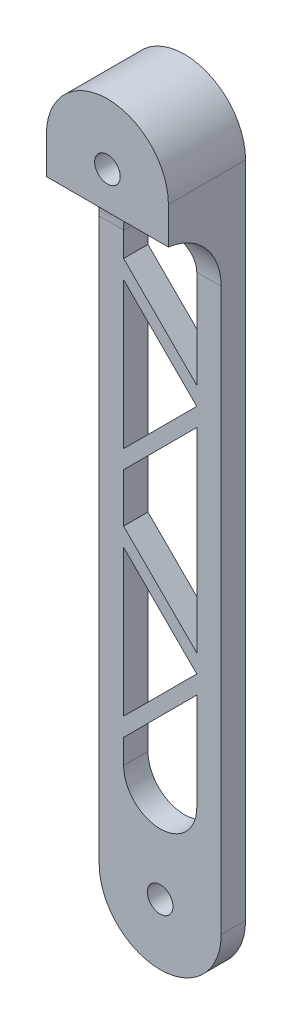
ISO-10303-21;
HEADER;
FILE_DESCRIPTION(('STEP AP214'),'2;1');
FILE_NAME('part.step','',(''),(''),'','','');
FILE_SCHEMA(('AUTOMOTIVE_DESIGN { 1 0 10303 214 1 1 1 1 }'));
ENDSEC;
DATA;
#1=APPLICATION_CONTEXT('core data for automotive mechanical design processes');
#2=APPLICATION_PROTOCOL_DEFINITION('international standard','automotive_design',2000,#1);
#3=PRODUCT_CONTEXT('',#1,'mechanical');
#4=PRODUCT('Part','Part','',(#3));
#5=PRODUCT_RELATED_PRODUCT_CATEGORY('part','',(#4));
#6=PRODUCT_DEFINITION_FORMATION('','',#4);
#7=PRODUCT_DEFINITION_CONTEXT('part definition',#1,'design');
#8=PRODUCT_DEFINITION('design','',#6,#7);
#9=PRODUCT_DEFINITION_SHAPE('','',#8);
#10=(LENGTH_UNIT() NAMED_UNIT(*) SI_UNIT(.MILLI.,.METRE.));
#11=(NAMED_UNIT(*) PLANE_ANGLE_UNIT() SI_UNIT($,.RADIAN.));
#12=(NAMED_UNIT(*) SI_UNIT($,.STERADIAN.) SOLID_ANGLE_UNIT());
#13=UNCERTAINTY_MEASURE_WITH_UNIT(LENGTH_MEASURE(1.E-05),#10,'distance_accuracy_value','');
#14=(GEOMETRIC_REPRESENTATION_CONTEXT(3) GLOBAL_UNCERTAINTY_ASSIGNED_CONTEXT((#13)) GLOBAL_UNIT_ASSIGNED_CONTEXT((#10,
#11,#12)) REPRESENTATION_CONTEXT('',''));
#15=CARTESIAN_POINT('',(0.,0.,0.));
#16=DIRECTION('',(0.,0.,1.));
#17=DIRECTION('',(1.,0.,0.));
#18=AXIS2_PLACEMENT_3D('',#15,#16,#17);
#19=CARTESIAN_POINT('',(0.,0.,4.));
#20=DIRECTION('',(0.,0.,1.));
#21=DIRECTION('',(1.,0.,0.));
#22=AXIS2_PLACEMENT_3D('',#19,#20,#21);
#23=PLANE('',#22);
#24=CARTESIAN_POINT('',(0.,-54.,4.));
#25=DIRECTION('',(0.,0.,1.));
#26=DIRECTION('',(1.,0.,0.));
#27=AXIS2_PLACEMENT_3D('',#24,#25,#26);
#28=CIRCLE('',#27,2.1);
#29=CARTESIAN_POINT('',(2.09999999999999,-54.,4.));
#30=VERTEX_POINT('',#29);
#31=EDGE_CURVE('E355',#30,#30,#28,.T.);
#32=ORIENTED_EDGE('',*,*,#31,.F.);
#33=EDGE_LOOP('',(#32));
#34=FACE_BOUND('',#33,.T.);
#35=DIRECTION('',(0.707106781186551,0.707106781186544,0.));
#36=VECTOR('',#35,1.);
#37=CARTESIAN_POINT('',(14.,-14.0000000000001,4.));
#38=LINE('',#37,#36);
#39=CARTESIAN_POINT('',(-6.00000000000002,-33.9999999999999,4.));
#40=VERTEX_POINT('',#39);
#41=CARTESIAN_POINT('',(5.99999999999999,-22.,4.));
#42=VERTEX_POINT('',#41);
#43=EDGE_CURVE('E391',#40,#42,#38,.T.);
#44=ORIENTED_EDGE('',*,*,#43,.T.);
#45=DIRECTION('',(0.,-1.,0.));
#46=VECTOR('',#45,1.);
#47=CARTESIAN_POINT('',(5.99999999999999,0.,4.));
#48=LINE('',#47,#46);
#49=CARTESIAN_POINT('',(5.99999999999999,-38.,4.));
#50=VERTEX_POINT('',#49);
#51=EDGE_CURVE('E379',#42,#50,#48,.T.);
#52=ORIENTED_EDGE('',*,*,#51,.T.);
#53=CARTESIAN_POINT('',(0.,-38.,4.));
#54=DIRECTION('',(0.,0.,1.));
#55=DIRECTION('',(1.,0.,0.));
#56=AXIS2_PLACEMENT_3D('',#53,#54,#55);
#57=CIRCLE('',#56,6.00000000000001);
#58=CARTESIAN_POINT('',(-6.00000000000002,-38.,4.));
#59=VERTEX_POINT('',#58);
#60=EDGE_CURVE('E392',#59,#50,#57,.T.);
#61=ORIENTED_EDGE('',*,*,#60,.F.);
#62=DIRECTION('',(0.,-1.,0.));
#63=VECTOR('',#62,1.);
#64=CARTESIAN_POINT('',(-6.00000000000002,0.,4.));
#65=LINE('',#64,#63);
#66=EDGE_CURVE('E389',#40,#59,#65,.T.);
#67=ORIENTED_EDGE('',*,*,#66,.F.);
#68=EDGE_LOOP('',(#44,#52,#61,#67));
#69=FACE_BOUND('',#68,.T.);
#70=DIRECTION('',(-0.707106781186551,0.707106781186544,0.));
#71=VECTOR('',#70,1.);
#72=CARTESIAN_POINT('',(-6.50000000000004,-6.5000000000001,4.));
#73=LINE('',#72,#71);
#74=CARTESIAN_POINT('',(5.99999999999999,-19.,4.));
#75=VERTEX_POINT('',#74);
#76=CARTESIAN_POINT('',(-6.00000000000002,-7.00000000000012,4.));
#77=VERTEX_POINT('',#76);
#78=EDGE_CURVE('E381',#75,#77,#73,.T.);
#79=ORIENTED_EDGE('',*,*,#78,.F.);
#80=DIRECTION('',(-0.707106781186551,-0.707106781186544,0.));
#81=VECTOR('',#80,1.);
#82=CARTESIAN_POINT('',(12.5,-12.5000000000001,4.));
#83=LINE('',#82,#81);
#84=CARTESIAN_POINT('',(-6.00000000000002,-30.9999999999999,4.));
#85=VERTEX_POINT('',#84);
#86=EDGE_CURVE('E390',#75,#85,#83,.T.);
#87=ORIENTED_EDGE('',*,*,#86,.T.);
#88=EDGE_CURVE('E384',#77,#85,#65,.T.);
#89=ORIENTED_EDGE('',*,*,#88,.F.);
#90=EDGE_LOOP('',(#79,#87,#89));
#91=FACE_BOUND('',#90,.T.);
#92=CARTESIAN_POINT('',(5.99999999999999,16.,4.));
#93=VERTEX_POINT('',#92);
#94=CARTESIAN_POINT('',(5.99999999999999,-16.,4.));
#95=VERTEX_POINT('',#94);
#96=EDGE_CURVE('E374',#93,#95,#48,.T.);
#97=ORIENTED_EDGE('',*,*,#96,.T.);
#98=DIRECTION('',(0.707106781186551,-0.707106781186544,0.));
#99=VECTOR('',#98,1.);
#100=CARTESIAN_POINT('',(-5.00000000000003,-5.00000000000008,4.));
#101=LINE('',#100,#99);
#102=CARTESIAN_POINT('',(-6.00000000000002,-4.00000000000011,4.));
#103=VERTEX_POINT('',#102);
#104=EDGE_CURVE('E377',#103,#95,#101,.T.);
#105=ORIENTED_EDGE('',*,*,#104,.F.);
#106=CARTESIAN_POINT('',(-6.00000000000002,4.00000000000011,4.));
#107=VERTEX_POINT('',#106);
#108=EDGE_CURVE('E366',#107,#103,#65,.T.);
#109=ORIENTED_EDGE('',*,*,#108,.F.);
#110=DIRECTION('',(0.707106781186551,0.707106781186544,0.));
#111=VECTOR('',#110,1.);
#112=CARTESIAN_POINT('',(-5.00000000000003,5.00000000000008,4.));
#113=LINE('',#112,#111);
#114=EDGE_CURVE('E375',#107,#93,#113,.T.);
#115=ORIENTED_EDGE('',*,*,#114,.T.);
#116=EDGE_LOOP('',(#97,#105,#109,#115));
#117=FACE_BOUND('',#116,.T.);
#118=DIRECTION('',(-0.707106781186551,0.707106781186544,0.));
#119=VECTOR('',#118,1.);
#120=CARTESIAN_POINT('',(12.5,12.5000000000001,4.));
#121=LINE('',#120,#119);
#122=CARTESIAN_POINT('',(5.99999999999999,19.,4.));
#123=VERTEX_POINT('',#122);
#124=CARTESIAN_POINT('',(-6.00000000000002,30.9999999999999,4.));
#125=VERTEX_POINT('',#124);
#126=EDGE_CURVE('E361',#123,#125,#121,.T.);
#127=ORIENTED_EDGE('',*,*,#126,.F.);
#128=DIRECTION('',(-0.707106781186551,-0.707106781186544,0.));
#129=VECTOR('',#128,1.);
#130=CARTESIAN_POINT('',(-6.50000000000004,6.5000000000001,4.));
#131=LINE('',#130,#129);
#132=CARTESIAN_POINT('',(-6.00000000000002,7.00000000000012,4.));
#133=VERTEX_POINT('',#132);
#134=EDGE_CURVE('E367',#123,#133,#131,.T.);
#135=ORIENTED_EDGE('',*,*,#134,.T.);
#136=EDGE_CURVE('E359',#125,#133,#65,.T.);
#137=ORIENTED_EDGE('',*,*,#136,.F.);
#138=EDGE_LOOP('',(#127,#135,#137));
#139=FACE_BOUND('',#138,.T.);
#140=DIRECTION('',(0.,-1.,0.));
#141=VECTOR('',#140,1.);
#142=CARTESIAN_POINT('',(10.,0.,4.));
#143=LINE('',#142,#141);
#144=CARTESIAN_POINT('',(10.,38.0415440153372,4.));
#145=VERTEX_POINT('',#144);
#146=CARTESIAN_POINT('',(9.99999999999999,-54.,4.));
#147=VERTEX_POINT('',#146);
#148=EDGE_CURVE('E400',#145,#147,#143,.T.);
#149=ORIENTED_EDGE('',*,*,#148,.F.);
#150=DIRECTION('',(-1.,0.,0.));
#151=VECTOR('',#150,1.);
#152=CARTESIAN_POINT('',(-9.99999999999999,38.0415440153372,4.));
#153=LINE('',#152,#151);
#154=CARTESIAN_POINT('',(5.99985617284196,38.0415440153372,4.));
#155=VERTEX_POINT('',#154);
#156=EDGE_CURVE('E507',#145,#155,#153,.T.);
#157=ORIENTED_EDGE('',*,*,#156,.T.);
#158=CARTESIAN_POINT('',(0.,38.,4.));
#159=DIRECTION('',(0.,0.,1.));
#160=DIRECTION('',(1.,0.,0.));
#161=AXIS2_PLACEMENT_3D('',#158,#159,#160);
#162=CIRCLE('',#161,6.00000000000001);
#163=CARTESIAN_POINT('',(5.99999999999999,38.,4.));
#164=VERTEX_POINT('',#163);
#165=EDGE_CURVE('E404',#164,#155,#162,.T.);
#166=ORIENTED_EDGE('',*,*,#165,.F.);
#167=CARTESIAN_POINT('',(5.99999999999999,22.,4.));
#168=VERTEX_POINT('',#167);
#169=EDGE_CURVE('E378',#164,#168,#48,.T.);
#170=ORIENTED_EDGE('',*,*,#169,.T.);
#171=DIRECTION('',(0.707106781186551,-0.707106781186544,0.));
#172=VECTOR('',#171,1.);
#173=CARTESIAN_POINT('',(14.,14.0000000000001,4.));
#174=LINE('',#173,#172);
#175=CARTESIAN_POINT('',(-6.00000000000002,33.9999999999999,4.));
#176=VERTEX_POINT('',#175);
#177=EDGE_CURVE('E402',#176,#168,#174,.T.);
#178=ORIENTED_EDGE('',*,*,#177,.F.);
#179=CARTESIAN_POINT('',(-6.00000000000002,38.,4.));
#180=VERTEX_POINT('',#179);
#181=EDGE_CURVE('E362',#180,#176,#65,.T.);
#182=ORIENTED_EDGE('',*,*,#181,.F.);
#183=CARTESIAN_POINT('',(-5.99985617284196,38.0415440153372,4.));
#184=VERTEX_POINT('',#183);
#185=EDGE_CURVE('E410',#184,#180,#162,.T.);
#186=ORIENTED_EDGE('',*,*,#185,.F.);
#187=DIRECTION('',(-1.,0.,0.));
#188=VECTOR('',#187,1.);
#189=CARTESIAN_POINT('',(-9.99999999999999,38.0415440153372,4.));
#190=LINE('',#189,#188);
#191=CARTESIAN_POINT('',(-9.99999999999999,38.0415440153372,4.));
#192=VERTEX_POINT('',#191);
#193=EDGE_CURVE('E172',#184,#192,#190,.T.);
#194=ORIENTED_EDGE('',*,*,#193,.T.);
#195=DIRECTION('',(0.,-1.,0.));
#196=VECTOR('',#195,1.);
#197=CARTESIAN_POINT('',(-9.99999999999999,0.,4.));
#198=LINE('',#197,#196);
#199=CARTESIAN_POINT('',(-9.99999999999999,-54.,4.));
#200=VERTEX_POINT('',#199);
#201=EDGE_CURVE('E397',#192,#200,#198,.T.);
#202=ORIENTED_EDGE('',*,*,#201,.T.);
#203=CARTESIAN_POINT('',(0.,-54.,4.));
#204=DIRECTION('',(0.,0.,1.));
#205=DIRECTION('',(1.,0.,0.));
#206=AXIS2_PLACEMENT_3D('',#203,#204,#205);
#207=CIRCLE('',#206,10.);
#208=EDGE_CURVE('E500',#200,#147,#207,.T.);
#209=ORIENTED_EDGE('',*,*,#208,.T.);
#210=EDGE_LOOP('',(#149,#157,#166,#170,#178,#182,#186,#194,#202,#209));
#211=FACE_BOUND('',#210,.T.);
#212=ADVANCED_FACE('F158',(#34,#69,#91,#117,#139,#211),#23,.T.);
#213=CARTESIAN_POINT('',(0.,54.,4.));
#214=DIRECTION('',(0.,0.,-1.));
#215=DIRECTION('',(-1.,0.,0.));
#216=AXIS2_PLACEMENT_3D('',#213,#214,#215);
#217=CYLINDRICAL_SURFACE('',#216,2.1);
#218=CARTESIAN_POINT('',(0.,54.,0.));
#219=DIRECTION('',(0.,0.,1.));
#220=DIRECTION('',(1.,0.,0.));
#221=AXIS2_PLACEMENT_3D('',#218,#219,#220);
#222=CIRCLE('',#221,2.1);
#223=CARTESIAN_POINT('',(2.09999999999999,54.,0.));
#224=VERTEX_POINT('',#223);
#225=EDGE_CURVE('E443',#224,#224,#222,.T.);
#226=ORIENTED_EDGE('',*,*,#225,.F.);
#227=EDGE_LOOP('',(#226));
#228=FACE_BOUND('',#227,.T.);
#229=CARTESIAN_POINT('',(0.,54.,12.6500000000001));
#230=DIRECTION('',(0.,0.,1.));
#231=DIRECTION('',(1.,0.,0.));
#232=AXIS2_PLACEMENT_3D('',#229,#230,#231);
#233=CIRCLE('',#232,2.1);
#234=CARTESIAN_POINT('',(2.09999999999999,54.,12.6500000000001));
#235=VERTEX_POINT('',#234);
#236=EDGE_CURVE('E358',#235,#235,#233,.T.);
#237=ORIENTED_EDGE('',*,*,#236,.T.);
#238=EDGE_LOOP('',(#237));
#239=FACE_BOUND('',#238,.T.);
#240=ADVANCED_FACE('F544',(#228,#239),#217,.F.);
#241=CARTESIAN_POINT('',(5.99999999999999,0.,4.));
#242=DIRECTION('',(1.,0.,0.));
#243=DIRECTION('',(0.,0.,-1.));
#244=AXIS2_PLACEMENT_3D('',#241,#242,#243);
#245=PLANE('',#244);
#246=DIRECTION('',(0.,-1.,0.));
#247=VECTOR('',#246,1.);
#248=CARTESIAN_POINT('',(5.99999999999999,0.,0.));
#249=LINE('',#248,#247);
#250=CARTESIAN_POINT('',(5.99999999999999,38.,0.));
#251=VERTEX_POINT('',#250);
#252=CARTESIAN_POINT('',(5.99999999999999,22.,0.));
#253=VERTEX_POINT('',#252);
#254=EDGE_CURVE('E364',#251,#253,#249,.T.);
#255=ORIENTED_EDGE('',*,*,#254,.T.);
#256=DIRECTION('',(0.,0.,-1.));
#257=VECTOR('',#256,1.);
#258=CARTESIAN_POINT('',(5.99999999999999,22.,4.));
#259=LINE('',#258,#257);
#260=EDGE_CURVE('E458',#168,#253,#259,.T.);
#261=ORIENTED_EDGE('',*,*,#260,.F.);
#262=ORIENTED_EDGE('',*,*,#169,.F.);
#263=DIRECTION('',(0.,0.,-1.));
#264=VECTOR('',#263,1.);
#265=CARTESIAN_POINT('',(5.99999999999999,38.,4.));
#266=LINE('',#265,#264);
#267=EDGE_CURVE('E459',#164,#251,#266,.T.);
#268=ORIENTED_EDGE('',*,*,#267,.T.);
#269=EDGE_LOOP('',(#255,#261,#262,#268));
#270=FACE_BOUND('',#269,.T.);
#271=ADVANCED_FACE('F524',(#270),#245,.F.);
#272=CARTESIAN_POINT('',(5.99999999999999,16.,0.));
#273=VERTEX_POINT('',#272);
#274=CARTESIAN_POINT('',(5.99999999999999,-16.,0.));
#275=VERTEX_POINT('',#274);
#276=EDGE_CURVE('E421',#273,#275,#249,.T.);
#277=ORIENTED_EDGE('',*,*,#276,.T.);
#278=DIRECTION('',(0.,0.,-1.));
#279=VECTOR('',#278,1.);
#280=CARTESIAN_POINT('',(5.99999999999999,-16.,4.));
#281=LINE('',#280,#279);
#282=EDGE_CURVE('E483',#95,#275,#281,.T.);
#283=ORIENTED_EDGE('',*,*,#282,.F.);
#284=ORIENTED_EDGE('',*,*,#96,.F.);
#285=DIRECTION('',(0.,0.,-1.));
#286=VECTOR('',#285,1.);
#287=CARTESIAN_POINT('',(5.99999999999999,16.,4.));
#288=LINE('',#287,#286);
#289=EDGE_CURVE('E488',#93,#273,#288,.T.);
#290=ORIENTED_EDGE('',*,*,#289,.T.);
#291=EDGE_LOOP('',(#277,#283,#284,#290));
#292=FACE_BOUND('',#291,.T.);
#293=ADVANCED_FACE('F569',(#292),#245,.F.);
#294=CARTESIAN_POINT('',(5.99999999999999,-22.,0.));
#295=VERTEX_POINT('',#294);
#296=CARTESIAN_POINT('',(5.99999999999999,-38.,0.));
#297=VERTEX_POINT('',#296);
#298=EDGE_CURVE('E430',#295,#297,#249,.T.);
#299=ORIENTED_EDGE('',*,*,#298,.T.);
#300=DIRECTION('',(0.,0.,-1.));
#301=VECTOR('',#300,1.);
#302=CARTESIAN_POINT('',(5.99999999999999,-38.,4.));
#303=LINE('',#302,#301);
#304=EDGE_CURVE('E469',#50,#297,#303,.T.);
#305=ORIENTED_EDGE('',*,*,#304,.F.);
#306=ORIENTED_EDGE('',*,*,#51,.F.);
#307=DIRECTION('',(0.,0.,-1.));
#308=VECTOR('',#307,1.);
#309=CARTESIAN_POINT('',(5.99999999999999,-22.,4.));
#310=LINE('',#309,#308);
#311=EDGE_CURVE('E475',#42,#295,#310,.T.);
#312=ORIENTED_EDGE('',*,*,#311,.T.);
#313=EDGE_LOOP('',(#299,#305,#306,#312));
#314=FACE_BOUND('',#313,.T.);
#315=ADVANCED_FACE('F553',(#314),#245,.F.);
#316=CARTESIAN_POINT('',(0.,-38.,4.));
#317=DIRECTION('',(0.,0.,-1.));
#318=DIRECTION('',(-1.,0.,0.));
#319=AXIS2_PLACEMENT_3D('',#316,#317,#318);
#320=CYLINDRICAL_SURFACE('',#319,6.00000000000001);
#321=CARTESIAN_POINT('',(0.,-38.,0.));
#322=DIRECTION('',(0.,0.,1.));
#323=DIRECTION('',(1.,0.,0.));
#324=AXIS2_PLACEMENT_3D('',#321,#322,#323);
#325=CIRCLE('',#324,6.00000000000001);
#326=CARTESIAN_POINT('',(-6.00000000000002,-38.,0.));
#327=VERTEX_POINT('',#326);
#328=EDGE_CURVE('E441',#327,#297,#325,.T.);
#329=ORIENTED_EDGE('',*,*,#328,.F.);
#330=DIRECTION('',(0.,0.,-1.));
#331=VECTOR('',#330,1.);
#332=CARTESIAN_POINT('',(-6.00000000000002,-38.,4.));
#333=LINE('',#332,#331);
#334=EDGE_CURVE('E470',#59,#327,#333,.T.);
#335=ORIENTED_EDGE('',*,*,#334,.F.);
#336=ORIENTED_EDGE('',*,*,#60,.T.);
#337=ORIENTED_EDGE('',*,*,#304,.T.);
#338=EDGE_LOOP('',(#329,#335,#336,#337));
#339=FACE_BOUND('',#338,.T.);
#340=ADVANCED_FACE('F532',(#339),#320,.F.);
#341=CARTESIAN_POINT('',(-6.00000000000002,0.,4.));
#342=DIRECTION('',(1.,0.,0.));
#343=DIRECTION('',(0.,0.,-1.));
#344=AXIS2_PLACEMENT_3D('',#341,#342,#343);
#345=PLANE('',#344);
#346=DIRECTION('',(0.,-1.,0.));
#347=VECTOR('',#346,1.);
#348=CARTESIAN_POINT('',(-6.00000000000002,0.,0.));
#349=LINE('',#348,#347);
#350=CARTESIAN_POINT('',(-6.00000000000002,38.,0.));
#351=VERTEX_POINT('',#350);
#352=CARTESIAN_POINT('',(-6.00000000000002,33.9999999999999,0.));
#353=VERTEX_POINT('',#352);
#354=EDGE_CURVE('E413',#351,#353,#349,.T.);
#355=ORIENTED_EDGE('',*,*,#354,.F.);
#356=DIRECTION('',(0.,0.,-1.));
#357=VECTOR('',#356,1.);
#358=CARTESIAN_POINT('',(-6.00000000000002,38.,4.));
#359=LINE('',#358,#357);
#360=EDGE_CURVE('E465',#180,#351,#359,.T.);
#361=ORIENTED_EDGE('',*,*,#360,.F.);
#362=ORIENTED_EDGE('',*,*,#181,.T.);
#363=DIRECTION('',(0.,0.,-1.));
#364=VECTOR('',#363,1.);
#365=CARTESIAN_POINT('',(-6.00000000000002,33.9999999999999,4.));
#366=LINE('',#365,#364);
#367=EDGE_CURVE('E462',#176,#353,#366,.T.);
#368=ORIENTED_EDGE('',*,*,#367,.T.);
#369=EDGE_LOOP('',(#355,#361,#362,#368));
#370=FACE_BOUND('',#369,.T.);
#371=ADVANCED_FACE('F530',(#370),#345,.T.);
#372=CARTESIAN_POINT('',(-6.00000000000002,30.9999999999999,0.));
#373=VERTEX_POINT('',#372);
#374=CARTESIAN_POINT('',(-6.00000000000002,7.00000000000012,0.));
#375=VERTEX_POINT('',#374);
#376=EDGE_CURVE('E407',#373,#375,#349,.T.);
#377=ORIENTED_EDGE('',*,*,#376,.F.);
#378=DIRECTION('',(0.,0.,-1.));
#379=VECTOR('',#378,1.);
#380=CARTESIAN_POINT('',(-6.00000000000002,30.9999999999999,4.));
#381=LINE('',#380,#379);
#382=EDGE_CURVE('E482',#125,#373,#381,.T.);
#383=ORIENTED_EDGE('',*,*,#382,.F.);
#384=ORIENTED_EDGE('',*,*,#136,.T.);
#385=DIRECTION('',(0.,0.,-1.));
#386=VECTOR('',#385,1.);
#387=CARTESIAN_POINT('',(-6.00000000000002,7.00000000000012,4.));
#388=LINE('',#387,#386);
#389=EDGE_CURVE('E490',#133,#375,#388,.T.);
#390=ORIENTED_EDGE('',*,*,#389,.T.);
#391=EDGE_LOOP('',(#377,#383,#384,#390));
#392=FACE_BOUND('',#391,.T.);
#393=ADVANCED_FACE('F529',(#392),#345,.T.);
#394=CARTESIAN_POINT('',(-6.00000000000002,4.00000000000011,0.));
#395=VERTEX_POINT('',#394);
#396=CARTESIAN_POINT('',(-6.00000000000002,-4.00000000000011,0.));
#397=VERTEX_POINT('',#396);
#398=EDGE_CURVE('E412',#395,#397,#349,.T.);
#399=ORIENTED_EDGE('',*,*,#398,.F.);
#400=DIRECTION('',(0.,0.,-1.));
#401=VECTOR('',#400,1.);
#402=CARTESIAN_POINT('',(-6.00000000000002,4.00000000000011,4.));
#403=LINE('',#402,#401);
#404=EDGE_CURVE('E478',#107,#395,#403,.T.);
#405=ORIENTED_EDGE('',*,*,#404,.F.);
#406=ORIENTED_EDGE('',*,*,#108,.T.);
#407=DIRECTION('',(0.,0.,-1.));
#408=VECTOR('',#407,1.);
#409=CARTESIAN_POINT('',(-6.00000000000002,-4.00000000000011,4.));
#410=LINE('',#409,#408);
#411=EDGE_CURVE('E481',#103,#397,#410,.T.);
#412=ORIENTED_EDGE('',*,*,#411,.T.);
#413=EDGE_LOOP('',(#399,#405,#406,#412));
#414=FACE_BOUND('',#413,.T.);
#415=ADVANCED_FACE('F652',(#414),#345,.T.);
#416=CARTESIAN_POINT('',(-6.00000000000002,-7.00000000000012,0.));
#417=VERTEX_POINT('',#416);
#418=CARTESIAN_POINT('',(-6.00000000000002,-30.9999999999999,0.));
#419=VERTEX_POINT('',#418);
#420=EDGE_CURVE('E427',#417,#419,#349,.T.);
#421=ORIENTED_EDGE('',*,*,#420,.F.);
#422=DIRECTION('',(0.,0.,-1.));
#423=VECTOR('',#422,1.);
#424=CARTESIAN_POINT('',(-6.00000000000002,-7.00000000000012,4.));
#425=LINE('',#424,#423);
#426=EDGE_CURVE('E468',#77,#417,#425,.T.);
#427=ORIENTED_EDGE('',*,*,#426,.F.);
#428=ORIENTED_EDGE('',*,*,#88,.T.);
#429=DIRECTION('',(0.,0.,-1.));
#430=VECTOR('',#429,1.);
#431=CARTESIAN_POINT('',(-6.00000000000002,-30.9999999999999,4.));
#432=LINE('',#431,#430);
#433=EDGE_CURVE('E474',#85,#419,#432,.T.);
#434=ORIENTED_EDGE('',*,*,#433,.T.);
#435=EDGE_LOOP('',(#421,#427,#428,#434));
#436=FACE_BOUND('',#435,.T.);
#437=ADVANCED_FACE('F676',(#436),#345,.T.);
#438=CARTESIAN_POINT('',(-6.00000000000002,-33.9999999999999,0.));
#439=VERTEX_POINT('',#438);
#440=EDGE_CURVE('E440',#439,#327,#349,.T.);
#441=ORIENTED_EDGE('',*,*,#440,.F.);
#442=DIRECTION('',(0.,0.,-1.));
#443=VECTOR('',#442,1.);
#444=CARTESIAN_POINT('',(-6.00000000000002,-33.9999999999999,4.));
#445=LINE('',#444,#443);
#446=EDGE_CURVE('E337',#40,#439,#445,.T.);
#447=ORIENTED_EDGE('',*,*,#446,.F.);
#448=ORIENTED_EDGE('',*,*,#66,.T.);
#449=ORIENTED_EDGE('',*,*,#334,.T.);
#450=EDGE_LOOP('',(#441,#447,#448,#449));
#451=FACE_BOUND('',#450,.T.);
#452=ADVANCED_FACE('F523',(#451),#345,.T.);
#453=CARTESIAN_POINT('',(0.,38.,4.));
#454=DIRECTION('',(0.,0.,-1.));
#455=DIRECTION('',(-1.,0.,0.));
#456=AXIS2_PLACEMENT_3D('',#453,#454,#455);
#457=CYLINDRICAL_SURFACE('',#456,6.00000000000001);
#458=CARTESIAN_POINT('',(0.,38.,0.));
#459=DIRECTION('',(0.,0.,1.));
#460=DIRECTION('',(1.,0.,0.));
#461=AXIS2_PLACEMENT_3D('',#458,#459,#460);
#462=CIRCLE('',#461,6.00000000000001);
#463=EDGE_CURVE('E454',#251,#351,#462,.T.);
#464=ORIENTED_EDGE('',*,*,#463,.F.);
#465=ORIENTED_EDGE('',*,*,#267,.F.);
#466=ORIENTED_EDGE('',*,*,#165,.T.);
#467=CARTESIAN_POINT('',(5.99985617284196,38.0415440153372,4.));
#468=CARTESIAN_POINT('',(5.99881625818639,38.1959720681927,3.9999680336454));
#469=CARTESIAN_POINT('',(5.99175695784477,38.3503406290125,4.00357594662264));
#470=CARTESIAN_POINT('',(5.96583042455678,38.6576792599744,4.01782297020019));
#471=CARTESIAN_POINT('',(5.94696923890893,38.8106500056545,4.02845848000866));
#472=CARTESIAN_POINT('',(5.89780445544586,39.113235787597,4.05643509886924));
#473=CARTESIAN_POINT('',(5.86756465959885,39.2628646956113,4.07373883079404));
#474=CARTESIAN_POINT('',(5.79602950589064,39.5585837166278,4.11461352392508));
#475=CARTESIAN_POINT('',(5.75473320409581,39.7046735263226,4.1381850202317));
#476=CARTESIAN_POINT('',(5.66165487883957,39.9920930661159,4.19099071269837));
#477=CARTESIAN_POINT('',(5.60989349153458,40.1334315354443,4.22021375968317));
#478=CARTESIAN_POINT('',(5.49637380103702,40.4108865484284,4.2836987753613));
#479=CARTESIAN_POINT('',(5.4346116271192,40.5470010448522,4.31796269461295));
#480=CARTESIAN_POINT('',(5.23505234919346,40.94666375537,4.42730891747043));
#481=CARTESIAN_POINT('',(5.08300112475198,41.2014743783571,4.50893481274183));
#482=CARTESIAN_POINT('',(4.73259670927678,41.7017548107539,4.68983962780456));
#483=CARTESIAN_POINT('',(4.53159694114525,41.945030715839,4.78999003235488));
#484=CARTESIAN_POINT('',(4.09488627649707,42.396658995961,4.99475542212424));
#485=CARTESIAN_POINT('',(3.85913725571636,42.6049724690742,5.09937522013912));
#486=CARTESIAN_POINT('',(3.46734262256376,42.8998545895506,5.25863979283176));
#487=CARTESIAN_POINT('',(3.32180152489449,42.9996937340468,5.31504124996342));
#488=CARTESIAN_POINT('',(3.02149999705288,43.1866955082772,5.42450381332019));
#489=CARTESIAN_POINT('',(2.86673807965794,43.2738560852455,5.4775643778399));
#490=CARTESIAN_POINT('',(2.54892736584236,43.4345783402626,5.57835069515963));
#491=CARTESIAN_POINT('',(2.38589021520764,43.508158488722,5.62608365842597));
#492=CARTESIAN_POINT('',(2.05220596481862,43.6409805954801,5.7143090809686));
#493=CARTESIAN_POINT('',(1.88156173113049,43.7002279006868,5.75480423885184));
#494=CARTESIAN_POINT('',(1.57566832441422,43.7910494332846,5.81797911063617));
#495=CARTESIAN_POINT('',(1.44177113346604,43.8258522552728,5.84260138810193));
#496=CARTESIAN_POINT('',(1.17096617082949,43.886261293672,5.88577406169523));
#497=CARTESIAN_POINT('',(1.03405906182046,43.9118695133172,5.90432578034131));
#498=CARTESIAN_POINT('',(0.758192668544502,43.9535353999139,5.93470243965306));
#499=CARTESIAN_POINT('',(0.619235519190942,43.9696023702658,5.94653393252772));
#500=CARTESIAN_POINT('',(0.340107292024641,43.9919887183194,5.96306007164698));
#501=CARTESIAN_POINT('',(0.1999361911589,43.9983079105004,5.96775458205976));
#502=CARTESIAN_POINT('',(-0.0807882727119149,44.0011005675476,5.96982632874263));
#503=CARTESIAN_POINT('',(-0.221341886226646,43.9975579464281,5.9671916100281));
#504=CARTESIAN_POINT('',(-0.501527006096622,43.9806497894797,5.95468265328845));
#505=CARTESIAN_POINT('',(-0.641158507809897,43.9672842042395,5.94480837884693));
#506=CARTESIAN_POINT('',(-0.918560907871984,43.9309205067059,5.91818391121733));
#507=CARTESIAN_POINT('',(-1.0563309297531,43.9079180096078,5.90143058812432));
#508=CARTESIAN_POINT('',(-1.32908539287978,43.8526002184303,5.86164778286868));
#509=CARTESIAN_POINT('',(-1.46406867330487,43.8202811241658,5.83861573986192));
#510=CARTESIAN_POINT('',(-1.8617476644519,43.7104322176087,5.76157072636355));
#511=CARTESIAN_POINT('',(-2.11935322520594,43.61971632739,5.69937976347753));
#512=CARTESIAN_POINT('',(-2.61629516395665,43.4063271384812,5.55989963375244));
#513=CARTESIAN_POINT('',(-2.85562471893719,43.2836419793357,5.48260486613701));
#514=CARTESIAN_POINT('',(-3.35405487802293,42.9848553890488,5.30524283684277));
#515=CARTESIAN_POINT('',(-3.60926297095261,42.8031596025432,5.20355908581687));
#516=CARTESIAN_POINT('',(-3.96819782666353,42.5030883195675,5.04972923327703));
#517=CARTESIAN_POINT('',(-4.08394539760454,42.3983827854989,4.99819392088354));
#518=CARTESIAN_POINT('',(-4.30712900180135,42.1800710622717,4.89576400395244));
#519=CARTESIAN_POINT('',(-4.4145636076294,42.0664633512222,4.8448695107012));
#520=CARTESIAN_POINT('',(-4.6341153823757,41.8152770928438,4.73825497351027));
#521=CARTESIAN_POINT('',(-4.74499441090399,41.6765099412487,4.68277903824705));
#522=CARTESIAN_POINT('',(-4.95457775715994,41.3887784298154,4.57558607004789));
#523=CARTESIAN_POINT('',(-5.05328665848912,41.2398179421373,4.52386762497165));
#524=CARTESIAN_POINT('',(-5.23763762054895,40.932448861728,4.4256231463368));
#525=CARTESIAN_POINT('',(-5.32328375460052,40.7740432357631,4.37909549536972));
#526=CARTESIAN_POINT('',(-5.48054256273264,40.4487277641901,4.29259213675572));
#527=CARTESIAN_POINT('',(-5.55215959215244,40.2818205782337,4.25261439631998));
#528=CARTESIAN_POINT('',(-5.66786585293199,39.9740329236458,4.18749863233787));
#529=CARTESIAN_POINT('',(-5.71459968911164,39.834431240694,4.16098716027857));
#530=CARTESIAN_POINT('',(-5.79786526994403,39.5512962395881,4.11358324563516));
#531=CARTESIAN_POINT('',(-5.83439894797852,39.4077636721821,4.09268973822569));
#532=CARTESIAN_POINT('',(-5.8967831404112,39.1179771909064,4.05703451342839));
#533=CARTESIAN_POINT('',(-5.92265650735668,38.971729808105,4.04225967906707));
#534=CARTESIAN_POINT('',(-5.96350269673104,38.6772757704928,4.01913700326452));
#535=CARTESIAN_POINT('',(-5.97848199142962,38.5290703323617,4.01078534558438));
#536=CARTESIAN_POINT('',(-5.99151131802797,38.324027890445,4.00383081559134));
#537=CARTESIAN_POINT('',(-5.99429882477325,38.2675477591579,4.0023943055023));
#538=CARTESIAN_POINT('',(-5.99827478618339,38.1545638278468,4.00047932507599));
#539=CARTESIAN_POINT('',(-5.99946461832064,38.0980600902806,4.00000002928012));
#540=CARTESIAN_POINT('',(-5.99985617284196,38.0415440153372,4.));
#541=B_SPLINE_CURVE_WITH_KNOTS('',3,(#467,#468,#469,#470,#471,#472,#473,#474,#475,#476,#477,
#478,#479,#480,#481,#482,#483,#484,#485,#486,#487,#488,#489,#490,#491,#492,#493,#494,#495,#496,
#497,#498,#499,#500,#501,#502,#503,#504,#505,#506,#507,#508,#509,#510,#511,#512,#513,#514,#515,
#516,#517,#518,#519,#520,#521,#522,#523,#524,#525,#526,#527,#528,#529,#530,#531,#532,#533,#534,
#535,#536,#537,#538,#539,#540),.UNSPECIFIED.,.F.,.F.,(4,2,2,2,2,2,2,2,2,2,2,2,2,2,2,2,2,2,2,2,2,
2,2,2,2,2,2,2,2,2,2,2,2,2,2,2,4),(0.,0.463108428815881,0.925979754486035,1.38629344229299,
1.84664644127135,2.30610036957612,2.76573255281917,3.68517719564095,4.67473297187397,
5.66538260843943,6.22066641238365,6.77604002157856,7.33065262299227,7.88505800442852,
8.30619555397142,8.72724129423919,9.14787580780412,9.5685183268311,9.98984737401809,
10.4111785405878,10.8327016218264,11.2543968837216,12.0912261127721,12.9283662448242,
13.9123060726112,14.4050569315195,14.8978922142785,15.455453975987,16.0128050990761,
16.5699820682481,17.1269857865894,17.5752690731068,18.023467332312,18.4706997245674,
18.9176661943581,19.087343626989,19.2568746741342),.UNSPECIFIED.);
#542=EDGE_CURVE('E512',#155,#184,#541,.T.);
#543=ORIENTED_EDGE('',*,*,#542,.T.);
#544=ORIENTED_EDGE('',*,*,#185,.T.);
#545=ORIENTED_EDGE('',*,*,#360,.T.);
#546=EDGE_LOOP('',(#464,#465,#466,#543,#544,#545));
#547=FACE_BOUND('',#546,.T.);
#548=ADVANCED_FACE('F520',(#547),#457,.F.);
#549=CARTESIAN_POINT('',(10.,0.,4.));
#550=DIRECTION('',(1.,0.,0.));
#551=DIRECTION('',(0.,0.,-1.));
#552=AXIS2_PLACEMENT_3D('',#549,#550,#551);
#553=PLANE('',#552);
#554=DIRECTION('',(0.,0.,-1.));
#555=VECTOR('',#554,1.);
#556=CARTESIAN_POINT('',(9.99999999999999,-54.,4.));
#557=LINE('',#556,#555);
#558=CARTESIAN_POINT('',(9.99999999999999,-54.,0.));
#559=VERTEX_POINT('',#558);
#560=EDGE_CURVE('E499',#147,#559,#557,.T.);
#561=ORIENTED_EDGE('',*,*,#560,.T.);
#562=DIRECTION('',(0.,-1.,0.));
#563=VECTOR('',#562,1.);
#564=CARTESIAN_POINT('',(10.,0.,0.));
#565=LINE('',#564,#563);
#566=CARTESIAN_POINT('',(10.,54.,0.));
#567=VERTEX_POINT('',#566);
#568=EDGE_CURVE('E450',#567,#559,#565,.T.);
#569=ORIENTED_EDGE('',*,*,#568,.F.);
#570=DIRECTION('',(0.,0.,-1.));
#571=VECTOR('',#570,1.);
#572=CARTESIAN_POINT('',(10.,54.,4.));
#573=LINE('',#572,#571);
#574=CARTESIAN_POINT('',(9.99999999999845,54.0000000000018,12.6500000000001));
#575=VERTEX_POINT('',#574);
#576=EDGE_CURVE('E334',#575,#567,#573,.T.);
#577=ORIENTED_EDGE('',*,*,#576,.F.);
#578=DIRECTION('',(0.,-1.,0.));
#579=VECTOR('',#578,1.);
#580=CARTESIAN_POINT('',(10.,0.,12.6500000000001));
#581=LINE('',#580,#579);
#582=CARTESIAN_POINT('',(9.99999999999845,47.95,12.6500000000001));
#583=VERTEX_POINT('',#582);
#584=EDGE_CURVE('E343',#575,#583,#581,.T.);
#585=ORIENTED_EDGE('',*,*,#584,.T.);
#586=CARTESIAN_POINT('',(10.,38.0415440153372,14.));
#587=DIRECTION('',(1.,0.,0.));
#588=DIRECTION('',(0.,0.,-1.));
#589=AXIS2_PLACEMENT_3D('',#586,#587,#588);
#590=CIRCLE('',#589,10.);
#591=EDGE_CURVE('E12',#583,#145,#590,.F.);
#592=ORIENTED_EDGE('',*,*,#591,.T.);
#593=ORIENTED_EDGE('',*,*,#148,.T.);
#594=EDGE_LOOP('',(#561,#569,#577,#585,#592,#593));
#595=FACE_BOUND('',#594,.T.);
#596=ADVANCED_FACE('F525',(#595),#553,.T.);
#597=CARTESIAN_POINT('',(-9.99999999999999,0.,4.));
#598=DIRECTION('',(1.,0.,0.));
#599=DIRECTION('',(0.,0.,-1.));
#600=AXIS2_PLACEMENT_3D('',#597,#598,#599);
#601=PLANE('',#600);
#602=ORIENTED_EDGE('',*,*,#201,.F.);
#603=CARTESIAN_POINT('',(-9.99999999999999,38.0415440153372,14.));
#604=DIRECTION('',(1.,0.,0.));
#605=DIRECTION('',(0.,0.,-1.));
#606=AXIS2_PLACEMENT_3D('',#603,#604,#605);
#607=CIRCLE('',#606,10.);
#608=CARTESIAN_POINT('',(-9.99999999999999,47.95,12.6500000000001));
#609=VERTEX_POINT('',#608);
#610=EDGE_CURVE('E170',#192,#609,#607,.T.);
#611=ORIENTED_EDGE('',*,*,#610,.T.);
#612=DIRECTION('',(0.,-1.,0.));
#613=VECTOR('',#612,1.);
#614=CARTESIAN_POINT('',(-9.99999999999999,0.,12.6500000000001));
#615=LINE('',#614,#613);
#616=CARTESIAN_POINT('',(-10.0000000000015,54.0000000000018,12.6500000000001));
#617=VERTEX_POINT('',#616);
#618=EDGE_CURVE('E345',#617,#609,#615,.T.);
#619=ORIENTED_EDGE('',*,*,#618,.F.);
#620=DIRECTION('',(0.,0.,-1.));
#621=VECTOR('',#620,1.);
#622=CARTESIAN_POINT('',(-9.99999999999999,54.,4.));
#623=LINE('',#622,#621);
#624=CARTESIAN_POINT('',(-9.99999999999999,54.,0.));
#625=VERTEX_POINT('',#624);
#626=EDGE_CURVE('E330',#617,#625,#623,.T.);
#627=ORIENTED_EDGE('',*,*,#626,.T.);
#628=DIRECTION('',(0.,-1.,0.));
#629=VECTOR('',#628,1.);
#630=CARTESIAN_POINT('',(-9.99999999999999,0.,0.));
#631=LINE('',#630,#629);
#632=CARTESIAN_POINT('',(-9.99999999999999,-54.,0.));
#633=VERTEX_POINT('',#632);
#634=EDGE_CURVE('E448',#625,#633,#631,.T.);
#635=ORIENTED_EDGE('',*,*,#634,.T.);
#636=DIRECTION('',(0.,0.,-1.));
#637=VECTOR('',#636,1.);
#638=CARTESIAN_POINT('',(-9.99999999999999,-54.,4.));
#639=LINE('',#638,#637);
#640=EDGE_CURVE('E415',#200,#633,#639,.T.);
#641=ORIENTED_EDGE('',*,*,#640,.F.);
#642=EDGE_LOOP('',(#602,#611,#619,#627,#635,#641));
#643=FACE_BOUND('',#642,.T.);
#644=ADVANCED_FACE('F350',(#643),#601,.F.);
#645=CARTESIAN_POINT('',(0.,54.,4.));
#646=DIRECTION('',(0.,0.,-1.));
#647=DIRECTION('',(-1.,0.,0.));
#648=AXIS2_PLACEMENT_3D('',#645,#646,#647);
#649=CYLINDRICAL_SURFACE('',#648,10.);
#650=CARTESIAN_POINT('',(0.,54.,0.));
#651=DIRECTION('',(0.,0.,1.));
#652=DIRECTION('',(1.,0.,0.));
#653=AXIS2_PLACEMENT_3D('',#650,#651,#652);
#654=CIRCLE('',#653,10.);
#655=EDGE_CURVE('E335',#567,#625,#654,.T.);
#656=ORIENTED_EDGE('',*,*,#655,.T.);
#657=ORIENTED_EDGE('',*,*,#626,.F.);
#658=CARTESIAN_POINT('',(0.,54.,12.6500000000001));
#659=DIRECTION('',(0.,0.,1.));
#660=DIRECTION('',(1.,0.,0.));
#661=AXIS2_PLACEMENT_3D('',#658,#659,#660);
#662=CIRCLE('',#661,10.);
#663=EDGE_CURVE('E329',#575,#617,#662,.T.);
#664=ORIENTED_EDGE('',*,*,#663,.F.);
#665=ORIENTED_EDGE('',*,*,#576,.T.);
#666=EDGE_LOOP('',(#656,#657,#664,#665));
#667=FACE_BOUND('',#666,.T.);
#668=ADVANCED_FACE('F327',(#667),#649,.T.);
#669=CARTESIAN_POINT('',(14.,14.0000000000001,4.));
#670=DIRECTION('',(0.707106781186544,0.707106781186551,0.));
#671=DIRECTION('',(-0.707106781186551,0.707106781186544,0.));
#672=AXIS2_PLACEMENT_3D('',#669,#670,#671);
#673=PLANE('',#672);
#674=DIRECTION('',(0.707106781186551,-0.707106781186544,0.));
#675=VECTOR('',#674,1.);
#676=CARTESIAN_POINT('',(14.,14.0000000000001,0.));
#677=LINE('',#676,#675);
#678=EDGE_CURVE('E455',#353,#253,#677,.T.);
#679=ORIENTED_EDGE('',*,*,#678,.F.);
#680=ORIENTED_EDGE('',*,*,#367,.F.);
#681=ORIENTED_EDGE('',*,*,#177,.T.);
#682=ORIENTED_EDGE('',*,*,#260,.T.);
#683=EDGE_LOOP('',(#679,#680,#681,#682));
#684=FACE_BOUND('',#683,.T.);
#685=ADVANCED_FACE('F531',(#684),#673,.T.);
#686=CARTESIAN_POINT('',(12.5,12.5000000000001,4.));
#687=DIRECTION('',(-0.707106781186544,-0.707106781186551,0.));
#688=DIRECTION('',(0.707106781186551,-0.707106781186544,0.));
#689=AXIS2_PLACEMENT_3D('',#686,#687,#688);
#690=PLANE('',#689);
#691=DIRECTION('',(-0.707106781186551,0.707106781186544,0.));
#692=VECTOR('',#691,1.);
#693=CARTESIAN_POINT('',(12.5,12.5000000000001,0.));
#694=LINE('',#693,#692);
#695=CARTESIAN_POINT('',(5.99999999999999,19.,0.));
#696=VERTEX_POINT('',#695);
#697=EDGE_CURVE('E411',#696,#373,#694,.T.);
#698=ORIENTED_EDGE('',*,*,#697,.F.);
#699=DIRECTION('',(0.,0.,-1.));
#700=VECTOR('',#699,1.);
#701=CARTESIAN_POINT('',(5.99999999999999,19.,4.));
#702=LINE('',#701,#700);
#703=EDGE_CURVE('E493',#123,#696,#702,.T.);
#704=ORIENTED_EDGE('',*,*,#703,.F.);
#705=ORIENTED_EDGE('',*,*,#126,.T.);
#706=ORIENTED_EDGE('',*,*,#382,.T.);
#707=EDGE_LOOP('',(#698,#704,#705,#706));
#708=FACE_BOUND('',#707,.T.);
#709=ADVANCED_FACE('F536',(#708),#690,.T.);
#710=CARTESIAN_POINT('',(0.,0.,0.));
#711=DIRECTION('',(0.,0.,1.));
#712=DIRECTION('',(1.,0.,0.));
#713=AXIS2_PLACEMENT_3D('',#710,#711,#712);
#714=PLANE('',#713);
#715=ORIENTED_EDGE('',*,*,#678,.T.);
#716=ORIENTED_EDGE('',*,*,#254,.F.);
#717=ORIENTED_EDGE('',*,*,#463,.T.);
#718=ORIENTED_EDGE('',*,*,#354,.T.);
#719=EDGE_LOOP('',(#715,#716,#717,#718));
#720=FACE_BOUND('',#719,.T.);
#721=DIRECTION('',(-0.707106781186551,-0.707106781186544,0.));
#722=VECTOR('',#721,1.);
#723=CARTESIAN_POINT('',(-6.50000000000004,6.5000000000001,0.));
#724=LINE('',#723,#722);
#725=EDGE_CURVE('E420',#696,#375,#724,.T.);
#726=ORIENTED_EDGE('',*,*,#725,.F.);
#727=ORIENTED_EDGE('',*,*,#697,.T.);
#728=ORIENTED_EDGE('',*,*,#376,.T.);
#729=EDGE_LOOP('',(#726,#727,#728));
#730=FACE_BOUND('',#729,.T.);
#731=DIRECTION('',(0.707106781186551,-0.707106781186544,0.));
#732=VECTOR('',#731,1.);
#733=CARTESIAN_POINT('',(-5.00000000000003,-5.00000000000008,0.));
#734=LINE('',#733,#732);
#735=EDGE_CURVE('E428',#397,#275,#734,.T.);
#736=ORIENTED_EDGE('',*,*,#735,.T.);
#737=ORIENTED_EDGE('',*,*,#276,.F.);
#738=DIRECTION('',(0.707106781186551,0.707106781186544,0.));
#739=VECTOR('',#738,1.);
#740=CARTESIAN_POINT('',(-5.00000000000003,5.00000000000008,0.));
#741=LINE('',#740,#739);
#742=EDGE_CURVE('E419',#395,#273,#741,.T.);
#743=ORIENTED_EDGE('',*,*,#742,.F.);
#744=ORIENTED_EDGE('',*,*,#398,.T.);
#745=EDGE_LOOP('',(#736,#737,#743,#744));
#746=FACE_BOUND('',#745,.T.);
#747=DIRECTION('',(-0.707106781186551,-0.707106781186544,0.));
#748=VECTOR('',#747,1.);
#749=CARTESIAN_POINT('',(12.5,-12.5000000000001,0.));
#750=LINE('',#749,#748);
#751=CARTESIAN_POINT('',(5.99999999999999,-19.,0.));
#752=VERTEX_POINT('',#751);
#753=EDGE_CURVE('E432',#752,#419,#750,.T.);
#754=ORIENTED_EDGE('',*,*,#753,.F.);
#755=DIRECTION('',(-0.707106781186551,0.707106781186544,0.));
#756=VECTOR('',#755,1.);
#757=CARTESIAN_POINT('',(-6.50000000000004,-6.5000000000001,0.));
#758=LINE('',#757,#756);
#759=EDGE_CURVE('E431',#752,#417,#758,.T.);
#760=ORIENTED_EDGE('',*,*,#759,.T.);
#761=ORIENTED_EDGE('',*,*,#420,.T.);
#762=EDGE_LOOP('',(#754,#760,#761));
#763=FACE_BOUND('',#762,.T.);
#764=ORIENTED_EDGE('',*,*,#298,.F.);
#765=DIRECTION('',(0.707106781186551,0.707106781186544,0.));
#766=VECTOR('',#765,1.);
#767=CARTESIAN_POINT('',(14.,-14.0000000000001,0.));
#768=LINE('',#767,#766);
#769=EDGE_CURVE('E438',#439,#295,#768,.T.);
#770=ORIENTED_EDGE('',*,*,#769,.F.);
#771=ORIENTED_EDGE('',*,*,#440,.T.);
#772=ORIENTED_EDGE('',*,*,#328,.T.);
#773=EDGE_LOOP('',(#764,#770,#771,#772));
#774=FACE_BOUND('',#773,.T.);
#775=CARTESIAN_POINT('',(0.,-54.,0.));
#776=DIRECTION('',(0.,0.,1.));
#777=DIRECTION('',(1.,0.,0.));
#778=AXIS2_PLACEMENT_3D('',#775,#776,#777);
#779=CIRCLE('',#778,10.);
#780=EDGE_CURVE('E492',#633,#559,#779,.T.);
#781=ORIENTED_EDGE('',*,*,#780,.F.);
#782=ORIENTED_EDGE('',*,*,#634,.F.);
#783=ORIENTED_EDGE('',*,*,#655,.F.);
#784=ORIENTED_EDGE('',*,*,#568,.T.);
#785=EDGE_LOOP('',(#781,#782,#783,#784));
#786=FACE_BOUND('',#785,.T.);
#787=CARTESIAN_POINT('',(0.,-54.,0.));
#788=DIRECTION('',(0.,0.,1.));
#789=DIRECTION('',(1.,0.,0.));
#790=AXIS2_PLACEMENT_3D('',#787,#788,#789);
#791=CIRCLE('',#790,2.1);
#792=CARTESIAN_POINT('',(2.09999999999999,-54.,0.));
#793=VERTEX_POINT('',#792);
#794=EDGE_CURVE('E347',#793,#793,#791,.T.);
#795=ORIENTED_EDGE('',*,*,#794,.T.);
#796=EDGE_LOOP('',(#795));
#797=FACE_BOUND('',#796,.T.);
#798=ORIENTED_EDGE('',*,*,#225,.T.);
#799=EDGE_LOOP('',(#798));
#800=FACE_BOUND('',#799,.T.);
#801=ADVANCED_FACE('F580',(#720,#730,#746,#763,#774,#786,#797,#800),#714,.F.);
#802=CARTESIAN_POINT('',(-6.50000000000004,6.5000000000001,4.));
#803=DIRECTION('',(0.707106781186544,-0.707106781186551,0.));
#804=DIRECTION('',(0.707106781186551,0.707106781186544,0.));
#805=AXIS2_PLACEMENT_3D('',#802,#803,#804);
#806=PLANE('',#805);
#807=ORIENTED_EDGE('',*,*,#725,.T.);
#808=ORIENTED_EDGE('',*,*,#389,.F.);
#809=ORIENTED_EDGE('',*,*,#134,.F.);
#810=ORIENTED_EDGE('',*,*,#703,.T.);
#811=EDGE_LOOP('',(#807,#808,#809,#810));
#812=FACE_BOUND('',#811,.T.);
#813=ADVANCED_FACE('F572',(#812),#806,.F.);
#814=CARTESIAN_POINT('',(-5.00000000000003,5.00000000000008,4.));
#815=DIRECTION('',(-0.707106781186544,0.707106781186551,0.));
#816=DIRECTION('',(-0.707106781186551,-0.707106781186544,0.));
#817=AXIS2_PLACEMENT_3D('',#814,#815,#816);
#818=PLANE('',#817);
#819=ORIENTED_EDGE('',*,*,#742,.T.);
#820=ORIENTED_EDGE('',*,*,#289,.F.);
#821=ORIENTED_EDGE('',*,*,#114,.F.);
#822=ORIENTED_EDGE('',*,*,#404,.T.);
#823=EDGE_LOOP('',(#819,#820,#821,#822));
#824=FACE_BOUND('',#823,.T.);
#825=ADVANCED_FACE('F568',(#824),#818,.F.);
#826=CARTESIAN_POINT('',(-5.00000000000003,-5.00000000000008,4.));
#827=DIRECTION('',(0.707106781186544,0.707106781186551,0.));
#828=DIRECTION('',(-0.707106781186551,0.707106781186544,0.));
#829=AXIS2_PLACEMENT_3D('',#826,#827,#828);
#830=PLANE('',#829);
#831=ORIENTED_EDGE('',*,*,#735,.F.);
#832=ORIENTED_EDGE('',*,*,#411,.F.);
#833=ORIENTED_EDGE('',*,*,#104,.T.);
#834=ORIENTED_EDGE('',*,*,#282,.T.);
#835=EDGE_LOOP('',(#831,#832,#833,#834));
#836=FACE_BOUND('',#835,.T.);
#837=ADVANCED_FACE('F562',(#836),#830,.T.);
#838=CARTESIAN_POINT('',(-6.50000000000004,-6.5000000000001,4.));
#839=DIRECTION('',(-0.707106781186544,-0.707106781186551,0.));
#840=DIRECTION('',(0.707106781186551,-0.707106781186544,0.));
#841=AXIS2_PLACEMENT_3D('',#838,#839,#840);
#842=PLANE('',#841);
#843=ORIENTED_EDGE('',*,*,#759,.F.);
#844=DIRECTION('',(0.,0.,-1.));
#845=VECTOR('',#844,1.);
#846=CARTESIAN_POINT('',(5.99999999999999,-19.,4.));
#847=LINE('',#846,#845);
#848=EDGE_CURVE('E480',#75,#752,#847,.T.);
#849=ORIENTED_EDGE('',*,*,#848,.F.);
#850=ORIENTED_EDGE('',*,*,#78,.T.);
#851=ORIENTED_EDGE('',*,*,#426,.T.);
#852=EDGE_LOOP('',(#843,#849,#850,#851));
#853=FACE_BOUND('',#852,.T.);
#854=ADVANCED_FACE('F557',(#853),#842,.T.);
#855=CARTESIAN_POINT('',(12.5,-12.5000000000001,4.));
#856=DIRECTION('',(0.707106781186544,-0.707106781186551,0.));
#857=DIRECTION('',(0.707106781186551,0.707106781186544,0.));
#858=AXIS2_PLACEMENT_3D('',#855,#856,#857);
#859=PLANE('',#858);
#860=ORIENTED_EDGE('',*,*,#753,.T.);
#861=ORIENTED_EDGE('',*,*,#433,.F.);
#862=ORIENTED_EDGE('',*,*,#86,.F.);
#863=ORIENTED_EDGE('',*,*,#848,.T.);
#864=EDGE_LOOP('',(#860,#861,#862,#863));
#865=FACE_BOUND('',#864,.T.);
#866=ADVANCED_FACE('F558',(#865),#859,.F.);
#867=CARTESIAN_POINT('',(14.,-14.0000000000001,4.));
#868=DIRECTION('',(-0.707106781186544,0.707106781186551,0.));
#869=DIRECTION('',(-0.707106781186551,-0.707106781186544,0.));
#870=AXIS2_PLACEMENT_3D('',#867,#868,#869);
#871=PLANE('',#870);
#872=ORIENTED_EDGE('',*,*,#769,.T.);
#873=ORIENTED_EDGE('',*,*,#311,.F.);
#874=ORIENTED_EDGE('',*,*,#43,.F.);
#875=ORIENTED_EDGE('',*,*,#446,.T.);
#876=EDGE_LOOP('',(#872,#873,#874,#875));
#877=FACE_BOUND('',#876,.T.);
#878=ADVANCED_FACE('F551',(#877),#871,.F.);
#879=CARTESIAN_POINT('',(0.,-54.,4.));
#880=DIRECTION('',(0.,0.,-1.));
#881=DIRECTION('',(-1.,0.,0.));
#882=AXIS2_PLACEMENT_3D('',#879,#880,#881);
#883=CYLINDRICAL_SURFACE('',#882,2.1);
#884=ORIENTED_EDGE('',*,*,#31,.T.);
#885=EDGE_LOOP('',(#884));
#886=FACE_BOUND('',#885,.T.);
#887=ORIENTED_EDGE('',*,*,#794,.F.);
#888=EDGE_LOOP('',(#887));
#889=FACE_BOUND('',#888,.T.);
#890=ADVANCED_FACE('F545',(#886,#889),#883,.F.);
#891=CARTESIAN_POINT('',(0.,-54.,4.));
#892=DIRECTION('',(0.,0.,-1.));
#893=DIRECTION('',(-1.,0.,0.));
#894=AXIS2_PLACEMENT_3D('',#891,#892,#893);
#895=CYLINDRICAL_SURFACE('',#894,10.);
#896=ORIENTED_EDGE('',*,*,#780,.T.);
#897=ORIENTED_EDGE('',*,*,#560,.F.);
#898=ORIENTED_EDGE('',*,*,#208,.F.);
#899=ORIENTED_EDGE('',*,*,#640,.T.);
#900=EDGE_LOOP('',(#896,#897,#898,#899));
#901=FACE_BOUND('',#900,.T.);
#902=ADVANCED_FACE('F582',(#901),#895,.T.);
#903=CARTESIAN_POINT('',(-1.55431223447522E-12,1.77635683940025E-12,12.6500000000001));
#904=DIRECTION('',(0.,0.,1.));
#905=DIRECTION('',(1.,0.,0.));
#906=AXIS2_PLACEMENT_3D('',#903,#904,#905);
#907=PLANE('',#906);
#908=ORIENTED_EDGE('',*,*,#236,.F.);
#909=EDGE_LOOP('',(#908));
#910=FACE_BOUND('',#909,.T.);
#911=DIRECTION('',(1.,0.,0.));
#912=VECTOR('',#911,1.);
#913=CARTESIAN_POINT('',(0.,47.95,12.6500000000001));
#914=LINE('',#913,#912);
#915=EDGE_CURVE('E344',#609,#583,#914,.T.);
#916=ORIENTED_EDGE('',*,*,#915,.T.);
#917=ORIENTED_EDGE('',*,*,#584,.F.);
#918=ORIENTED_EDGE('',*,*,#663,.T.);
#919=ORIENTED_EDGE('',*,*,#618,.T.);
#920=EDGE_LOOP('',(#916,#917,#918,#919));
#921=FACE_BOUND('',#920,.T.);
#922=ADVANCED_FACE('F341',(#910,#921),#907,.T.);
#923=CARTESIAN_POINT('',(0.,38.0415440153372,14.));
#924=DIRECTION('',(1.,0.,0.));
#925=DIRECTION('',(0.,0.,-1.));
#926=AXIS2_PLACEMENT_3D('',#923,#924,#925);
#927=CYLINDRICAL_SURFACE('',#926,10.);
#928=ORIENTED_EDGE('',*,*,#591,.F.);
#929=ORIENTED_EDGE('',*,*,#915,.F.);
#930=ORIENTED_EDGE('',*,*,#610,.F.);
#931=ORIENTED_EDGE('',*,*,#193,.F.);
#932=ORIENTED_EDGE('',*,*,#542,.F.);
#933=ORIENTED_EDGE('',*,*,#156,.F.);
#934=EDGE_LOOP('',(#928,#929,#930,#931,#932,#933));
#935=FACE_BOUND('',#934,.T.);
#936=ADVANCED_FACE('F159',(#935),#927,.F.);
#937=CLOSED_SHELL('',(#212,#240,#271,#293,#315,#340,#371,#393,#415,#437,#452,#548,#596,#644,
#668,#685,#709,#801,#813,#825,#837,#854,#866,#878,#890,#902,#922,#936));
#938=MANIFOLD_SOLID_BREP('B2',#937);
#939=ADVANCED_BREP_SHAPE_REPRESENTATION('',(#18,#938),#14);
#940=SHAPE_DEFINITION_REPRESENTATION(#9,#939);
ENDSEC;
END-ISO-10303-21;
